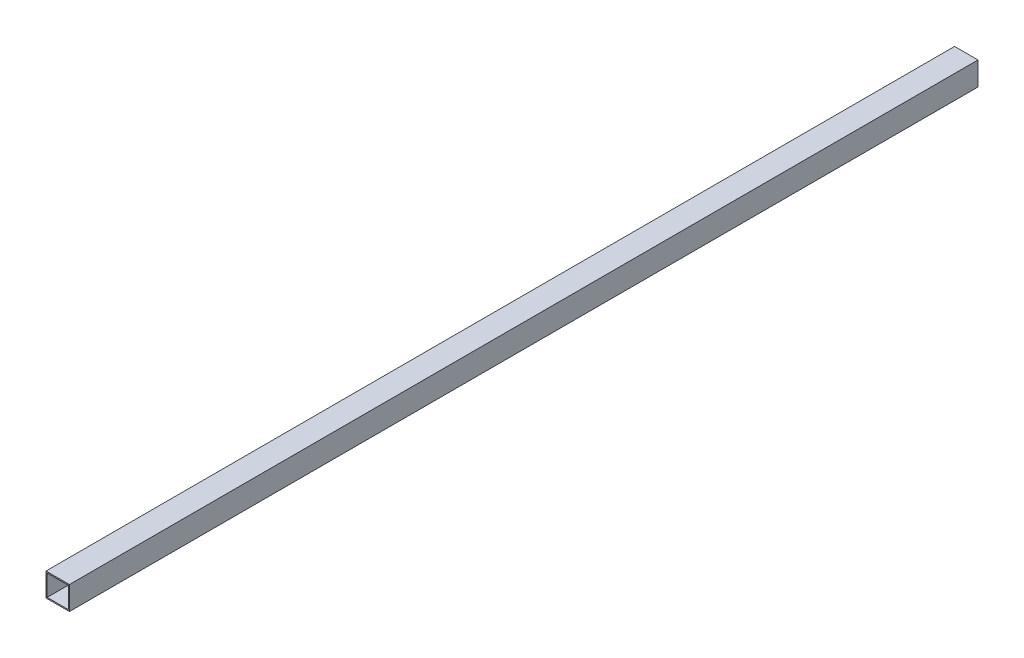
ISO-10303-21;
HEADER;
FILE_DESCRIPTION(('STEP AP214'),'2;1');
FILE_NAME('part.step','',(''),(''),'','','');
FILE_SCHEMA(('AUTOMOTIVE_DESIGN { 1 0 10303 214 1 1 1 1 }'));
ENDSEC;
DATA;
#1=APPLICATION_CONTEXT('core data for automotive mechanical design processes');
#2=APPLICATION_PROTOCOL_DEFINITION('international standard','automotive_design',2000,#1);
#3=PRODUCT_CONTEXT('',#1,'mechanical');
#4=PRODUCT('Part','Part','',(#3));
#5=PRODUCT_RELATED_PRODUCT_CATEGORY('part','',(#4));
#6=PRODUCT_DEFINITION_FORMATION('','',#4);
#7=PRODUCT_DEFINITION_CONTEXT('part definition',#1,'design');
#8=PRODUCT_DEFINITION('design','',#6,#7);
#9=PRODUCT_DEFINITION_SHAPE('','',#8);
#10=(LENGTH_UNIT() NAMED_UNIT(*) SI_UNIT(.MILLI.,.METRE.));
#11=(NAMED_UNIT(*) PLANE_ANGLE_UNIT() SI_UNIT($,.RADIAN.));
#12=(NAMED_UNIT(*) SI_UNIT($,.STERADIAN.) SOLID_ANGLE_UNIT());
#13=UNCERTAINTY_MEASURE_WITH_UNIT(LENGTH_MEASURE(1.E-05),#10,'distance_accuracy_value','');
#14=(GEOMETRIC_REPRESENTATION_CONTEXT(3) GLOBAL_UNCERTAINTY_ASSIGNED_CONTEXT((#13)) GLOBAL_UNIT_ASSIGNED_CONTEXT((#10,
#11,#12)) REPRESENTATION_CONTEXT('',''));
#15=CARTESIAN_POINT('',(0.,0.,0.));
#16=DIRECTION('',(0.,0.,1.));
#17=DIRECTION('',(1.,0.,0.));
#18=AXIS2_PLACEMENT_3D('',#15,#16,#17);
#19=CARTESIAN_POINT('',(0.,0.,0.));
#20=DIRECTION('',(0.,0.,1.));
#21=DIRECTION('',(1.,0.,0.));
#22=AXIS2_PLACEMENT_3D('',#19,#20,#21);
#23=PLANE('',#22);
#24=DIRECTION('',(0.,-1.,0.));
#25=VECTOR('',#24,1.);
#26=CARTESIAN_POINT('',(-590.,845.,0.));
#27=LINE('',#26,#25);
#28=CARTESIAN_POINT('',(-590.,845.,0.));
#29=VERTEX_POINT('',#28);
#30=CARTESIAN_POINT('',(-590.,805.,0.));
#31=VERTEX_POINT('',#30);
#32=EDGE_CURVE('E128',#29,#31,#27,.T.);
#33=ORIENTED_EDGE('',*,*,#32,.F.);
#34=DIRECTION('',(-1.,0.,0.));
#35=VECTOR('',#34,1.);
#36=CARTESIAN_POINT('',(-590.,845.,0.));
#37=LINE('',#36,#35);
#38=CARTESIAN_POINT('',(-550.,845.,0.));
#39=VERTEX_POINT('',#38);
#40=EDGE_CURVE('E100',#39,#29,#37,.T.);
#41=ORIENTED_EDGE('',*,*,#40,.F.);
#42=DIRECTION('',(0.,1.,0.));
#43=VECTOR('',#42,1.);
#44=CARTESIAN_POINT('',(-550.,845.,0.));
#45=LINE('',#44,#43);
#46=CARTESIAN_POINT('',(-550.,805.,0.));
#47=VERTEX_POINT('',#46);
#48=EDGE_CURVE('E122',#47,#39,#45,.T.);
#49=ORIENTED_EDGE('',*,*,#48,.F.);
#50=DIRECTION('',(1.,0.,0.));
#51=VECTOR('',#50,1.);
#52=CARTESIAN_POINT('',(-590.,805.,0.));
#53=LINE('',#52,#51);
#54=EDGE_CURVE('E119',#31,#47,#53,.T.);
#55=ORIENTED_EDGE('',*,*,#54,.F.);
#56=EDGE_LOOP('',(#33,#41,#49,#55));
#57=FACE_BOUND('',#56,.T.);
#58=DIRECTION('',(0.,-1.,0.));
#59=VECTOR('',#58,1.);
#60=CARTESIAN_POINT('',(-588.,843.,0.));
#61=LINE('',#60,#59);
#62=CARTESIAN_POINT('',(-588.,843.,0.));
#63=VERTEX_POINT('',#62);
#64=CARTESIAN_POINT('',(-588.,807.,0.));
#65=VERTEX_POINT('',#64);
#66=EDGE_CURVE('E97',#63,#65,#61,.T.);
#67=ORIENTED_EDGE('',*,*,#66,.T.);
#68=DIRECTION('',(1.,0.,0.));
#69=VECTOR('',#68,1.);
#70=CARTESIAN_POINT('',(-588.,807.,0.));
#71=LINE('',#70,#69);
#72=CARTESIAN_POINT('',(-552.,807.,0.));
#73=VERTEX_POINT('',#72);
#74=EDGE_CURVE('E103',#65,#73,#71,.T.);
#75=ORIENTED_EDGE('',*,*,#74,.T.);
#76=DIRECTION('',(0.,1.,0.));
#77=VECTOR('',#76,1.);
#78=CARTESIAN_POINT('',(-552.,843.,0.));
#79=LINE('',#78,#77);
#80=CARTESIAN_POINT('',(-552.,843.,0.));
#81=VERTEX_POINT('',#80);
#82=EDGE_CURVE('E107',#73,#81,#79,.T.);
#83=ORIENTED_EDGE('',*,*,#82,.T.);
#84=DIRECTION('',(-1.,0.,0.));
#85=VECTOR('',#84,1.);
#86=CARTESIAN_POINT('',(-588.,843.,0.));
#87=LINE('',#86,#85);
#88=EDGE_CURVE('E110',#81,#63,#87,.T.);
#89=ORIENTED_EDGE('',*,*,#88,.T.);
#90=EDGE_LOOP('',(#67,#75,#83,#89));
#91=FACE_BOUND('',#90,.T.);
#92=ADVANCED_FACE('F32',(#57,#91),#23,.F.);
#93=CARTESIAN_POINT('',(-590.,845.,1608.06854249492));
#94=DIRECTION('',(1.,0.,0.));
#95=DIRECTION('',(0.,0.,-1.));
#96=AXIS2_PLACEMENT_3D('',#93,#94,#95);
#97=PLANE('',#96);
#98=DIRECTION('',(0.,0.,-1.));
#99=VECTOR('',#98,1.);
#100=CARTESIAN_POINT('',(-590.,805.,1608.06854249492));
#101=LINE('',#100,#99);
#102=CARTESIAN_POINT('',(-590.,805.,1551.5));
#103=VERTEX_POINT('',#102);
#104=EDGE_CURVE('E117',#103,#31,#101,.T.);
#105=ORIENTED_EDGE('',*,*,#104,.F.);
#106=DIRECTION('',(0.,1.,0.));
#107=VECTOR('',#106,1.);
#108=CARTESIAN_POINT('',(-590.,845.,1551.5));
#109=LINE('',#108,#107);
#110=CARTESIAN_POINT('',(-590.,845.,1551.5));
#111=VERTEX_POINT('',#110);
#112=EDGE_CURVE('E129',#103,#111,#109,.T.);
#113=ORIENTED_EDGE('',*,*,#112,.T.);
#114=DIRECTION('',(0.,0.,-1.));
#115=VECTOR('',#114,1.);
#116=CARTESIAN_POINT('',(-590.,845.,1608.06854249492));
#117=LINE('',#116,#115);
#118=EDGE_CURVE('E127',#111,#29,#117,.T.);
#119=ORIENTED_EDGE('',*,*,#118,.T.);
#120=ORIENTED_EDGE('',*,*,#32,.T.);
#121=EDGE_LOOP('',(#105,#113,#119,#120));
#122=FACE_BOUND('',#121,.T.);
#123=ADVANCED_FACE('F159',(#122),#97,.F.);
#124=CARTESIAN_POINT('',(-590.,805.,1608.06854249492));
#125=DIRECTION('',(0.,1.,0.));
#126=DIRECTION('',(0.,0.,1.));
#127=AXIS2_PLACEMENT_3D('',#124,#125,#126);
#128=PLANE('',#127);
#129=DIRECTION('',(0.,0.,-1.));
#130=VECTOR('',#129,1.);
#131=CARTESIAN_POINT('',(-550.,805.,1608.06854249492));
#132=LINE('',#131,#130);
#133=CARTESIAN_POINT('',(-550.,805.,1551.5));
#134=VERTEX_POINT('',#133);
#135=EDGE_CURVE('E120',#134,#47,#132,.T.);
#136=ORIENTED_EDGE('',*,*,#135,.F.);
#137=DIRECTION('',(-1.,0.,0.));
#138=VECTOR('',#137,1.);
#139=CARTESIAN_POINT('',(-590.,805.,1551.5));
#140=LINE('',#139,#138);
#141=EDGE_CURVE('E49',#134,#103,#140,.T.);
#142=ORIENTED_EDGE('',*,*,#141,.T.);
#143=ORIENTED_EDGE('',*,*,#104,.T.);
#144=ORIENTED_EDGE('',*,*,#54,.T.);
#145=EDGE_LOOP('',(#136,#142,#143,#144));
#146=FACE_BOUND('',#145,.T.);
#147=ADVANCED_FACE('F180',(#146),#128,.F.);
#148=CARTESIAN_POINT('',(-550.,845.,1608.06854249492));
#149=DIRECTION('',(-1.,0.,0.));
#150=DIRECTION('',(0.,0.,1.));
#151=AXIS2_PLACEMENT_3D('',#148,#149,#150);
#152=PLANE('',#151);
#153=DIRECTION('',(0.,0.,-1.));
#154=VECTOR('',#153,1.);
#155=CARTESIAN_POINT('',(-550.,845.,1608.06854249492));
#156=LINE('',#155,#154);
#157=CARTESIAN_POINT('',(-550.,845.,1551.5));
#158=VERTEX_POINT('',#157);
#159=EDGE_CURVE('E124',#158,#39,#156,.T.);
#160=ORIENTED_EDGE('',*,*,#159,.F.);
#161=DIRECTION('',(0.,-1.,0.));
#162=VECTOR('',#161,1.);
#163=CARTESIAN_POINT('',(-550.,845.,1551.5));
#164=LINE('',#163,#162);
#165=EDGE_CURVE('E123',#158,#134,#164,.T.);
#166=ORIENTED_EDGE('',*,*,#165,.T.);
#167=ORIENTED_EDGE('',*,*,#135,.T.);
#168=ORIENTED_EDGE('',*,*,#48,.T.);
#169=EDGE_LOOP('',(#160,#166,#167,#168));
#170=FACE_BOUND('',#169,.T.);
#171=ADVANCED_FACE('F178',(#170),#152,.F.);
#172=CARTESIAN_POINT('',(-590.,845.,1608.06854249492));
#173=DIRECTION('',(0.,-1.,0.));
#174=DIRECTION('',(0.,0.,-1.));
#175=AXIS2_PLACEMENT_3D('',#172,#173,#174);
#176=PLANE('',#175);
#177=ORIENTED_EDGE('',*,*,#118,.F.);
#178=DIRECTION('',(1.,0.,0.));
#179=VECTOR('',#178,1.);
#180=CARTESIAN_POINT('',(-590.,845.,1551.5));
#181=LINE('',#180,#179);
#182=EDGE_CURVE('E126',#111,#158,#181,.T.);
#183=ORIENTED_EDGE('',*,*,#182,.T.);
#184=ORIENTED_EDGE('',*,*,#159,.T.);
#185=ORIENTED_EDGE('',*,*,#40,.T.);
#186=EDGE_LOOP('',(#177,#183,#184,#185));
#187=FACE_BOUND('',#186,.T.);
#188=ADVANCED_FACE('F163',(#187),#176,.F.);
#189=CARTESIAN_POINT('',(-588.,843.,1608.06854249492));
#190=DIRECTION('',(1.,0.,0.));
#191=DIRECTION('',(0.,0.,-1.));
#192=AXIS2_PLACEMENT_3D('',#189,#190,#191);
#193=PLANE('',#192);
#194=DIRECTION('',(0.,1.,0.));
#195=VECTOR('',#194,1.);
#196=CARTESIAN_POINT('',(-588.,843.,1551.5));
#197=LINE('',#196,#195);
#198=CARTESIAN_POINT('',(-588.,807.,1551.5));
#199=VERTEX_POINT('',#198);
#200=CARTESIAN_POINT('',(-588.,843.,1551.5));
#201=VERTEX_POINT('',#200);
#202=EDGE_CURVE('E99',#199,#201,#197,.T.);
#203=ORIENTED_EDGE('',*,*,#202,.F.);
#204=DIRECTION('',(0.,0.,-1.));
#205=VECTOR('',#204,1.);
#206=CARTESIAN_POINT('',(-588.,807.,1608.06854249492));
#207=LINE('',#206,#205);
#208=EDGE_CURVE('E93',#199,#65,#207,.T.);
#209=ORIENTED_EDGE('',*,*,#208,.T.);
#210=ORIENTED_EDGE('',*,*,#66,.F.);
#211=DIRECTION('',(0.,0.,-1.));
#212=VECTOR('',#211,1.);
#213=CARTESIAN_POINT('',(-588.,843.,1608.06854249492));
#214=LINE('',#213,#212);
#215=EDGE_CURVE('E134',#201,#63,#214,.T.);
#216=ORIENTED_EDGE('',*,*,#215,.F.);
#217=EDGE_LOOP('',(#203,#209,#210,#216));
#218=FACE_BOUND('',#217,.T.);
#219=ADVANCED_FACE('F94',(#218),#193,.T.);
#220=CARTESIAN_POINT('',(-588.,807.,1608.06854249492));
#221=DIRECTION('',(0.,1.,0.));
#222=DIRECTION('',(0.,0.,1.));
#223=AXIS2_PLACEMENT_3D('',#220,#221,#222);
#224=PLANE('',#223);
#225=DIRECTION('',(-1.,0.,0.));
#226=VECTOR('',#225,1.);
#227=CARTESIAN_POINT('',(-588.,807.,1551.5));
#228=LINE('',#227,#226);
#229=CARTESIAN_POINT('',(-552.,807.,1551.5));
#230=VERTEX_POINT('',#229);
#231=EDGE_CURVE('E11',#230,#199,#228,.T.);
#232=ORIENTED_EDGE('',*,*,#231,.F.);
#233=DIRECTION('',(0.,0.,-1.));
#234=VECTOR('',#233,1.);
#235=CARTESIAN_POINT('',(-552.,807.,1608.06854249492));
#236=LINE('',#235,#234);
#237=EDGE_CURVE('E86',#230,#73,#236,.T.);
#238=ORIENTED_EDGE('',*,*,#237,.T.);
#239=ORIENTED_EDGE('',*,*,#74,.F.);
#240=ORIENTED_EDGE('',*,*,#208,.F.);
#241=EDGE_LOOP('',(#232,#238,#239,#240));
#242=FACE_BOUND('',#241,.T.);
#243=ADVANCED_FACE('F104',(#242),#224,.T.);
#244=CARTESIAN_POINT('',(-552.,843.,1608.06854249492));
#245=DIRECTION('',(-1.,0.,0.));
#246=DIRECTION('',(0.,0.,1.));
#247=AXIS2_PLACEMENT_3D('',#244,#245,#246);
#248=PLANE('',#247);
#249=DIRECTION('',(0.,-1.,0.));
#250=VECTOR('',#249,1.);
#251=CARTESIAN_POINT('',(-552.,843.,1551.5));
#252=LINE('',#251,#250);
#253=CARTESIAN_POINT('',(-552.,843.,1551.5));
#254=VERTEX_POINT('',#253);
#255=EDGE_CURVE('E36',#254,#230,#252,.T.);
#256=ORIENTED_EDGE('',*,*,#255,.F.);
#257=DIRECTION('',(0.,0.,-1.));
#258=VECTOR('',#257,1.);
#259=CARTESIAN_POINT('',(-552.,843.,1608.06854249492));
#260=LINE('',#259,#258);
#261=EDGE_CURVE('E132',#254,#81,#260,.T.);
#262=ORIENTED_EDGE('',*,*,#261,.T.);
#263=ORIENTED_EDGE('',*,*,#82,.F.);
#264=ORIENTED_EDGE('',*,*,#237,.F.);
#265=EDGE_LOOP('',(#256,#262,#263,#264));
#266=FACE_BOUND('',#265,.T.);
#267=ADVANCED_FACE('F148',(#266),#248,.T.);
#268=CARTESIAN_POINT('',(-588.,843.,1608.06854249492));
#269=DIRECTION('',(0.,-1.,0.));
#270=DIRECTION('',(0.,0.,-1.));
#271=AXIS2_PLACEMENT_3D('',#268,#269,#270);
#272=PLANE('',#271);
#273=DIRECTION('',(1.,0.,0.));
#274=VECTOR('',#273,1.);
#275=CARTESIAN_POINT('',(-588.,843.,1551.5));
#276=LINE('',#275,#274);
#277=EDGE_CURVE('E114',#201,#254,#276,.T.);
#278=ORIENTED_EDGE('',*,*,#277,.F.);
#279=ORIENTED_EDGE('',*,*,#215,.T.);
#280=ORIENTED_EDGE('',*,*,#88,.F.);
#281=ORIENTED_EDGE('',*,*,#261,.F.);
#282=EDGE_LOOP('',(#278,#279,#280,#281));
#283=FACE_BOUND('',#282,.T.);
#284=ADVANCED_FACE('F145',(#283),#272,.T.);
#285=CARTESIAN_POINT('',(-590.,1650.,1551.5));
#286=DIRECTION('',(0.,0.,-1.));
#287=DIRECTION('',(0.,1.,0.));
#288=AXIS2_PLACEMENT_3D('',#285,#286,#287);
#289=PLANE('',#288);
#290=ORIENTED_EDGE('',*,*,#202,.T.);
#291=ORIENTED_EDGE('',*,*,#277,.T.);
#292=ORIENTED_EDGE('',*,*,#255,.T.);
#293=ORIENTED_EDGE('',*,*,#231,.T.);
#294=EDGE_LOOP('',(#290,#291,#292,#293));
#295=FACE_BOUND('',#294,.T.);
#296=ORIENTED_EDGE('',*,*,#165,.F.);
#297=ORIENTED_EDGE('',*,*,#182,.F.);
#298=ORIENTED_EDGE('',*,*,#112,.F.);
#299=ORIENTED_EDGE('',*,*,#141,.F.);
#300=EDGE_LOOP('',(#296,#297,#298,#299));
#301=FACE_BOUND('',#300,.T.);
#302=ADVANCED_FACE('F34',(#295,#301),#289,.F.);
#303=CLOSED_SHELL('',(#92,#123,#147,#171,#188,#219,#243,#267,#284,#302));
#304=MANIFOLD_SOLID_BREP('B2',#303);
#305=ADVANCED_BREP_SHAPE_REPRESENTATION('',(#18,#304),#14);
#306=SHAPE_DEFINITION_REPRESENTATION(#9,#305);
ENDSEC;
END-ISO-10303-21;
